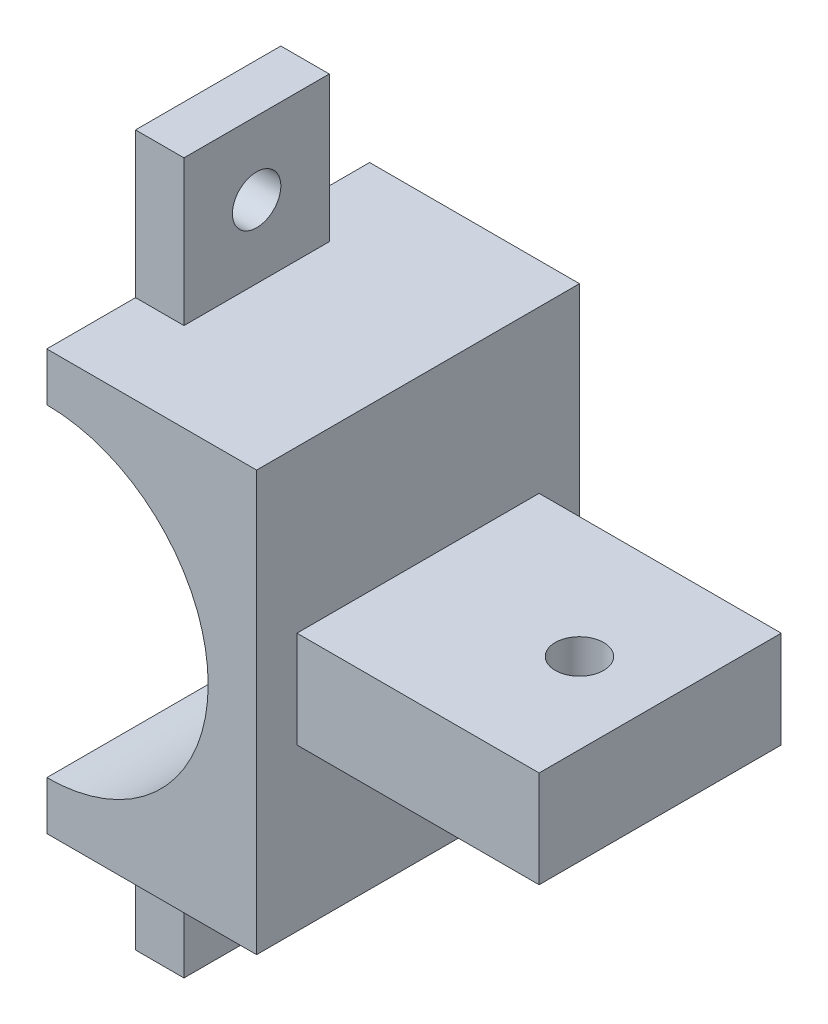
ISO-10303-21;
HEADER;
FILE_DESCRIPTION(('STEP AP214'),'2;1');
FILE_NAME('part.step','',(''),(''),'','','');
FILE_SCHEMA(('AUTOMOTIVE_DESIGN { 1 0 10303 214 1 1 1 1 }'));
ENDSEC;
DATA;
#1=APPLICATION_CONTEXT('core data for automotive mechanical design processes');
#2=APPLICATION_PROTOCOL_DEFINITION('international standard','automotive_design',2000,#1);
#3=PRODUCT_CONTEXT('',#1,'mechanical');
#4=PRODUCT('Part','Part','',(#3));
#5=PRODUCT_RELATED_PRODUCT_CATEGORY('part','',(#4));
#6=PRODUCT_DEFINITION_FORMATION('','',#4);
#7=PRODUCT_DEFINITION_CONTEXT('part definition',#1,'design');
#8=PRODUCT_DEFINITION('design','',#6,#7);
#9=PRODUCT_DEFINITION_SHAPE('','',#8);
#10=(LENGTH_UNIT() NAMED_UNIT(*) SI_UNIT(.MILLI.,.METRE.));
#11=(NAMED_UNIT(*) PLANE_ANGLE_UNIT() SI_UNIT($,.RADIAN.));
#12=(NAMED_UNIT(*) SI_UNIT($,.STERADIAN.) SOLID_ANGLE_UNIT());
#13=UNCERTAINTY_MEASURE_WITH_UNIT(LENGTH_MEASURE(1.E-05),#10,'distance_accuracy_value','');
#14=(GEOMETRIC_REPRESENTATION_CONTEXT(3) GLOBAL_UNCERTAINTY_ASSIGNED_CONTEXT((#13)) GLOBAL_UNIT_ASSIGNED_CONTEXT((#10,
#11,#12)) REPRESENTATION_CONTEXT('',''));
#15=CARTESIAN_POINT('',(0.,0.,0.));
#16=DIRECTION('',(0.,0.,1.));
#17=DIRECTION('',(1.,0.,0.));
#18=AXIS2_PLACEMENT_3D('',#15,#16,#17);
#19=CARTESIAN_POINT('',(13.,13.,20.));
#20=DIRECTION('',(-1.,0.,0.));
#21=DIRECTION('',(0.,0.,1.));
#22=AXIS2_PLACEMENT_3D('',#19,#20,#21);
#23=PLANE('',#22);
#24=DIRECTION('',(0.,1.,0.));
#25=VECTOR('',#24,1.);
#26=CARTESIAN_POINT('',(13.,13.,0.));
#27=LINE('',#26,#25);
#28=CARTESIAN_POINT('',(13.,-13.,0.));
#29=VERTEX_POINT('',#28);
#30=CARTESIAN_POINT('',(13.,13.,0.));
#31=VERTEX_POINT('',#30);
#32=EDGE_CURVE('E328',#29,#31,#27,.T.);
#33=ORIENTED_EDGE('',*,*,#32,.T.);
#34=DIRECTION('',(0.,0.,-1.));
#35=VECTOR('',#34,1.);
#36=CARTESIAN_POINT('',(13.,13.,20.));
#37=LINE('',#36,#35);
#38=CARTESIAN_POINT('',(13.,13.,20.));
#39=VERTEX_POINT('',#38);
#40=EDGE_CURVE('E345',#39,#31,#37,.T.);
#41=ORIENTED_EDGE('',*,*,#40,.F.);
#42=DIRECTION('',(0.,1.,0.));
#43=VECTOR('',#42,1.);
#44=CARTESIAN_POINT('',(13.,13.,20.));
#45=LINE('',#44,#43);
#46=CARTESIAN_POINT('',(13.,-13.,20.));
#47=VERTEX_POINT('',#46);
#48=EDGE_CURVE('E308',#47,#39,#45,.T.);
#49=ORIENTED_EDGE('',*,*,#48,.F.);
#50=DIRECTION('',(0.,0.,-1.));
#51=VECTOR('',#50,1.);
#52=CARTESIAN_POINT('',(13.,-13.,20.));
#53=LINE('',#52,#51);
#54=EDGE_CURVE('E349',#47,#29,#53,.T.);
#55=ORIENTED_EDGE('',*,*,#54,.T.);
#56=EDGE_LOOP('',(#33,#41,#49,#55));
#57=FACE_BOUND('',#56,.T.);
#58=DIRECTION('',(0.,0.,1.));
#59=VECTOR('',#58,1.);
#60=CARTESIAN_POINT('',(13.,3.,17.5));
#61=LINE('',#60,#59);
#62=CARTESIAN_POINT('',(13.,3.,2.5));
#63=VERTEX_POINT('',#62);
#64=CARTESIAN_POINT('',(13.,3.,17.5));
#65=VERTEX_POINT('',#64);
#66=EDGE_CURVE('E56',#63,#65,#61,.T.);
#67=ORIENTED_EDGE('',*,*,#66,.F.);
#68=DIRECTION('',(0.,1.,0.));
#69=VECTOR('',#68,1.);
#70=CARTESIAN_POINT('',(13.,-3.,2.5));
#71=LINE('',#70,#69);
#72=CARTESIAN_POINT('',(13.,-3.,2.5));
#73=VERTEX_POINT('',#72);
#74=EDGE_CURVE('E60',#73,#63,#71,.T.);
#75=ORIENTED_EDGE('',*,*,#74,.F.);
#76=DIRECTION('',(0.,0.,-1.));
#77=VECTOR('',#76,1.);
#78=CARTESIAN_POINT('',(13.,-3.,17.5));
#79=LINE('',#78,#77);
#80=CARTESIAN_POINT('',(13.,-3.,17.5));
#81=VERTEX_POINT('',#80);
#82=EDGE_CURVE('E203',#81,#73,#79,.T.);
#83=ORIENTED_EDGE('',*,*,#82,.F.);
#84=DIRECTION('',(0.,-1.,0.));
#85=VECTOR('',#84,1.);
#86=CARTESIAN_POINT('',(13.,3.,17.5));
#87=LINE('',#86,#85);
#88=EDGE_CURVE('E200',#65,#81,#87,.T.);
#89=ORIENTED_EDGE('',*,*,#88,.F.);
#90=EDGE_LOOP('',(#67,#75,#83,#89));
#91=FACE_BOUND('',#90,.T.);
#92=ADVANCED_FACE('F39',(#57,#91),#23,.F.);
#93=CARTESIAN_POINT('',(0.,0.,20.));
#94=DIRECTION('',(0.,0.,-1.));
#95=DIRECTION('',(-1.,0.,0.));
#96=AXIS2_PLACEMENT_3D('',#93,#94,#95);
#97=CYLINDRICAL_SURFACE('',#96,10.);
#98=CARTESIAN_POINT('',(0.,0.,0.));
#99=DIRECTION('',(0.,0.,-1.));
#100=DIRECTION('',(-1.,0.,0.));
#101=AXIS2_PLACEMENT_3D('',#98,#99,#100);
#102=CIRCLE('',#101,10.);
#103=CARTESIAN_POINT('',(0.,10.,0.));
#104=VERTEX_POINT('',#103);
#105=CARTESIAN_POINT('',(0.,-10.,0.));
#106=VERTEX_POINT('',#105);
#107=EDGE_CURVE('E296',#104,#106,#102,.T.);
#108=ORIENTED_EDGE('',*,*,#107,.T.);
#109=DIRECTION('',(0.,0.,-1.));
#110=VECTOR('',#109,1.);
#111=CARTESIAN_POINT('',(0.,-10.,20.));
#112=LINE('',#111,#110);
#113=CARTESIAN_POINT('',(0.,-10.,20.));
#114=VERTEX_POINT('',#113);
#115=EDGE_CURVE('E357',#114,#106,#112,.T.);
#116=ORIENTED_EDGE('',*,*,#115,.F.);
#117=CARTESIAN_POINT('',(0.,0.,20.));
#118=DIRECTION('',(0.,0.,-1.));
#119=DIRECTION('',(-1.,0.,0.));
#120=AXIS2_PLACEMENT_3D('',#117,#118,#119);
#121=CIRCLE('',#120,10.);
#122=CARTESIAN_POINT('',(0.,10.,20.));
#123=VERTEX_POINT('',#122);
#124=EDGE_CURVE('E297',#123,#114,#121,.T.);
#125=ORIENTED_EDGE('',*,*,#124,.F.);
#126=DIRECTION('',(0.,0.,-1.));
#127=VECTOR('',#126,1.);
#128=CARTESIAN_POINT('',(0.,10.,20.));
#129=LINE('',#128,#127);
#130=EDGE_CURVE('E317',#123,#104,#129,.T.);
#131=ORIENTED_EDGE('',*,*,#130,.T.);
#132=EDGE_LOOP('',(#108,#116,#125,#131));
#133=FACE_BOUND('',#132,.T.);
#134=ADVANCED_FACE('F41',(#133),#97,.F.);
#135=CARTESIAN_POINT('',(0.,-10.,20.));
#136=DIRECTION('',(1.,0.,0.));
#137=DIRECTION('',(0.,0.,-1.));
#138=AXIS2_PLACEMENT_3D('',#135,#136,#137);
#139=PLANE('',#138);
#140=ORIENTED_EDGE('',*,*,#115,.T.);
#141=DIRECTION('',(0.,-1.,0.));
#142=VECTOR('',#141,1.);
#143=CARTESIAN_POINT('',(0.,-10.,0.));
#144=LINE('',#143,#142);
#145=CARTESIAN_POINT('',(0.,-13.,0.));
#146=VERTEX_POINT('',#145);
#147=EDGE_CURVE('E321',#106,#146,#144,.T.);
#148=ORIENTED_EDGE('',*,*,#147,.T.);
#149=DIRECTION('',(0.,0.,-1.));
#150=VECTOR('',#149,1.);
#151=CARTESIAN_POINT('',(0.,-13.,20.));
#152=LINE('',#151,#150);
#153=CARTESIAN_POINT('',(0.,-13.,5.5));
#154=VERTEX_POINT('',#153);
#155=EDGE_CURVE('E353',#154,#146,#152,.T.);
#156=ORIENTED_EDGE('',*,*,#155,.F.);
#157=DIRECTION('',(0.,-1.,0.));
#158=VECTOR('',#157,1.);
#159=CARTESIAN_POINT('',(0.,-10.,5.5));
#160=LINE('',#159,#158);
#161=CARTESIAN_POINT('',(0.,-22.,5.5));
#162=VERTEX_POINT('',#161);
#163=EDGE_CURVE('E229',#154,#162,#160,.T.);
#164=ORIENTED_EDGE('',*,*,#163,.T.);
#165=DIRECTION('',(0.,0.,1.));
#166=VECTOR('',#165,1.);
#167=CARTESIAN_POINT('',(0.,-22.,5.5));
#168=LINE('',#167,#166);
#169=CARTESIAN_POINT('',(0.,-22.,14.5));
#170=VERTEX_POINT('',#169);
#171=EDGE_CURVE('E220',#162,#170,#168,.T.);
#172=ORIENTED_EDGE('',*,*,#171,.T.);
#173=DIRECTION('',(0.,1.,0.));
#174=VECTOR('',#173,1.);
#175=CARTESIAN_POINT('',(0.,-22.,14.5));
#176=LINE('',#175,#174);
#177=CARTESIAN_POINT('',(0.,-13.,14.5));
#178=VERTEX_POINT('',#177);
#179=EDGE_CURVE('E240',#170,#178,#176,.T.);
#180=ORIENTED_EDGE('',*,*,#179,.T.);
#181=CARTESIAN_POINT('',(0.,-13.,20.));
#182=VERTEX_POINT('',#181);
#183=EDGE_CURVE('E354',#182,#178,#152,.T.);
#184=ORIENTED_EDGE('',*,*,#183,.F.);
#185=DIRECTION('',(0.,-1.,0.));
#186=VECTOR('',#185,1.);
#187=CARTESIAN_POINT('',(0.,-10.,20.));
#188=LINE('',#187,#186);
#189=EDGE_CURVE('E301',#114,#182,#188,.T.);
#190=ORIENTED_EDGE('',*,*,#189,.F.);
#191=EDGE_LOOP('',(#140,#148,#156,#164,#172,#180,#184,#190));
#192=FACE_BOUND('',#191,.T.);
#193=CARTESIAN_POINT('',(0.,-17.5,10.));
#194=DIRECTION('',(-1.,0.,0.));
#195=DIRECTION('',(0.,0.,1.));
#196=AXIS2_PLACEMENT_3D('',#193,#194,#195);
#197=CIRCLE('',#196,1.5);
#198=CARTESIAN_POINT('',(0.,-17.5,11.5));
#199=VERTEX_POINT('',#198);
#200=EDGE_CURVE('E182',#199,#199,#197,.T.);
#201=ORIENTED_EDGE('',*,*,#200,.F.);
#202=EDGE_LOOP('',(#201));
#203=FACE_BOUND('',#202,.T.);
#204=ADVANCED_FACE('F395',(#192,#203),#139,.F.);
#205=CARTESIAN_POINT('',(13.,-13.,20.));
#206=DIRECTION('',(0.,1.,0.));
#207=DIRECTION('',(0.,0.,1.));
#208=AXIS2_PLACEMENT_3D('',#205,#206,#207);
#209=PLANE('',#208);
#210=DIRECTION('',(0.,0.,1.));
#211=VECTOR('',#210,1.);
#212=CARTESIAN_POINT('',(3.,-13.,20.));
#213=LINE('',#212,#211);
#214=CARTESIAN_POINT('',(3.,-13.,5.5));
#215=VERTEX_POINT('',#214);
#216=CARTESIAN_POINT('',(3.,-13.,14.5));
#217=VERTEX_POINT('',#216);
#218=EDGE_CURVE('E364',#215,#217,#213,.T.);
#219=ORIENTED_EDGE('',*,*,#218,.F.);
#220=DIRECTION('',(-1.,0.,0.));
#221=VECTOR('',#220,1.);
#222=CARTESIAN_POINT('',(13.,-13.,5.5));
#223=LINE('',#222,#221);
#224=EDGE_CURVE('E11',#215,#154,#223,.T.);
#225=ORIENTED_EDGE('',*,*,#224,.T.);
#226=ORIENTED_EDGE('',*,*,#155,.T.);
#227=DIRECTION('',(1.,0.,0.));
#228=VECTOR('',#227,1.);
#229=CARTESIAN_POINT('',(13.,-13.,0.));
#230=LINE('',#229,#228);
#231=EDGE_CURVE('E325',#146,#29,#230,.T.);
#232=ORIENTED_EDGE('',*,*,#231,.T.);
#233=ORIENTED_EDGE('',*,*,#54,.F.);
#234=DIRECTION('',(1.,0.,0.));
#235=VECTOR('',#234,1.);
#236=CARTESIAN_POINT('',(13.,-13.,20.));
#237=LINE('',#236,#235);
#238=EDGE_CURVE('E305',#182,#47,#237,.T.);
#239=ORIENTED_EDGE('',*,*,#238,.F.);
#240=ORIENTED_EDGE('',*,*,#183,.T.);
#241=DIRECTION('',(1.,0.,0.));
#242=VECTOR('',#241,1.);
#243=CARTESIAN_POINT('',(13.,-13.,14.5));
#244=LINE('',#243,#242);
#245=EDGE_CURVE('E49',#178,#217,#244,.T.);
#246=ORIENTED_EDGE('',*,*,#245,.T.);
#247=EDGE_LOOP('',(#219,#225,#226,#232,#233,#239,#240,#246));
#248=FACE_BOUND('',#247,.T.);
#249=ADVANCED_FACE('F371',(#248),#209,.F.);
#250=CARTESIAN_POINT('',(0.,13.,20.));
#251=DIRECTION('',(0.,-1.,0.));
#252=DIRECTION('',(0.,0.,-1.));
#253=AXIS2_PLACEMENT_3D('',#250,#251,#252);
#254=PLANE('',#253);
#255=DIRECTION('',(0.,0.,-1.));
#256=VECTOR('',#255,1.);
#257=CARTESIAN_POINT('',(0.,13.,20.));
#258=LINE('',#257,#256);
#259=CARTESIAN_POINT('',(0.,13.,5.5));
#260=VERTEX_POINT('',#259);
#261=CARTESIAN_POINT('',(0.,13.,0.));
#262=VERTEX_POINT('',#261);
#263=EDGE_CURVE('E340',#260,#262,#258,.T.);
#264=ORIENTED_EDGE('',*,*,#263,.F.);
#265=DIRECTION('',(1.,0.,0.));
#266=VECTOR('',#265,1.);
#267=CARTESIAN_POINT('',(0.,13.,5.5));
#268=LINE('',#267,#266);
#269=CARTESIAN_POINT('',(3.,13.,5.5));
#270=VERTEX_POINT('',#269);
#271=EDGE_CURVE('E292',#260,#270,#268,.T.);
#272=ORIENTED_EDGE('',*,*,#271,.T.);
#273=DIRECTION('',(0.,0.,1.));
#274=VECTOR('',#273,1.);
#275=CARTESIAN_POINT('',(3.,13.,20.));
#276=LINE('',#275,#274);
#277=CARTESIAN_POINT('',(3.,13.,14.5));
#278=VERTEX_POINT('',#277);
#279=EDGE_CURVE('E360',#270,#278,#276,.T.);
#280=ORIENTED_EDGE('',*,*,#279,.T.);
#281=DIRECTION('',(-1.,0.,0.));
#282=VECTOR('',#281,1.);
#283=CARTESIAN_POINT('',(0.,13.,14.5));
#284=LINE('',#283,#282);
#285=CARTESIAN_POINT('',(0.,13.,14.5));
#286=VERTEX_POINT('',#285);
#287=EDGE_CURVE('E285',#278,#286,#284,.T.);
#288=ORIENTED_EDGE('',*,*,#287,.T.);
#289=CARTESIAN_POINT('',(0.,13.,20.));
#290=VERTEX_POINT('',#289);
#291=EDGE_CURVE('E341',#290,#286,#258,.T.);
#292=ORIENTED_EDGE('',*,*,#291,.F.);
#293=DIRECTION('',(-1.,0.,0.));
#294=VECTOR('',#293,1.);
#295=CARTESIAN_POINT('',(0.,13.,20.));
#296=LINE('',#295,#294);
#297=EDGE_CURVE('E311',#39,#290,#296,.T.);
#298=ORIENTED_EDGE('',*,*,#297,.F.);
#299=ORIENTED_EDGE('',*,*,#40,.T.);
#300=DIRECTION('',(-1.,0.,0.));
#301=VECTOR('',#300,1.);
#302=CARTESIAN_POINT('',(0.,13.,0.));
#303=LINE('',#302,#301);
#304=EDGE_CURVE('E331',#31,#262,#303,.T.);
#305=ORIENTED_EDGE('',*,*,#304,.T.);
#306=EDGE_LOOP('',(#264,#272,#280,#288,#292,#298,#299,#305));
#307=FACE_BOUND('',#306,.T.);
#308=ADVANCED_FACE('F410',(#307),#254,.F.);
#309=CARTESIAN_POINT('',(0.,10.,20.));
#310=DIRECTION('',(1.,0.,0.));
#311=DIRECTION('',(0.,0.,-1.));
#312=AXIS2_PLACEMENT_3D('',#309,#310,#311);
#313=PLANE('',#312);
#314=ORIENTED_EDGE('',*,*,#291,.T.);
#315=DIRECTION('',(0.,1.,0.));
#316=VECTOR('',#315,1.);
#317=CARTESIAN_POINT('',(0.,22.,14.5));
#318=LINE('',#317,#316);
#319=CARTESIAN_POINT('',(0.,22.,14.5));
#320=VERTEX_POINT('',#319);
#321=EDGE_CURVE('E257',#286,#320,#318,.T.);
#322=ORIENTED_EDGE('',*,*,#321,.T.);
#323=DIRECTION('',(0.,0.,-1.));
#324=VECTOR('',#323,1.);
#325=CARTESIAN_POINT('',(0.,22.,5.5));
#326=LINE('',#325,#324);
#327=CARTESIAN_POINT('',(0.,22.,5.5));
#328=VERTEX_POINT('',#327);
#329=EDGE_CURVE('E276',#320,#328,#326,.T.);
#330=ORIENTED_EDGE('',*,*,#329,.T.);
#331=DIRECTION('',(0.,-1.,0.));
#332=VECTOR('',#331,1.);
#333=CARTESIAN_POINT('',(0.,10.,5.5));
#334=LINE('',#333,#332);
#335=EDGE_CURVE('E265',#328,#260,#334,.T.);
#336=ORIENTED_EDGE('',*,*,#335,.T.);
#337=ORIENTED_EDGE('',*,*,#263,.T.);
#338=DIRECTION('',(0.,-1.,0.));
#339=VECTOR('',#338,1.);
#340=CARTESIAN_POINT('',(0.,10.,0.));
#341=LINE('',#340,#339);
#342=EDGE_CURVE('E302',#262,#104,#341,.T.);
#343=ORIENTED_EDGE('',*,*,#342,.T.);
#344=ORIENTED_EDGE('',*,*,#130,.F.);
#345=DIRECTION('',(0.,-1.,0.));
#346=VECTOR('',#345,1.);
#347=CARTESIAN_POINT('',(0.,10.,20.));
#348=LINE('',#347,#346);
#349=EDGE_CURVE('E314',#290,#123,#348,.T.);
#350=ORIENTED_EDGE('',*,*,#349,.F.);
#351=EDGE_LOOP('',(#314,#322,#330,#336,#337,#343,#344,#350));
#352=FACE_BOUND('',#351,.T.);
#353=CARTESIAN_POINT('',(0.,17.5,10.));
#354=DIRECTION('',(-1.,0.,0.));
#355=DIRECTION('',(0.,0.,1.));
#356=AXIS2_PLACEMENT_3D('',#353,#354,#355);
#357=CIRCLE('',#356,1.5);
#358=CARTESIAN_POINT('',(0.,17.5,11.5));
#359=VERTEX_POINT('',#358);
#360=EDGE_CURVE('E250',#359,#359,#357,.T.);
#361=ORIENTED_EDGE('',*,*,#360,.F.);
#362=EDGE_LOOP('',(#361));
#363=FACE_BOUND('',#362,.T.);
#364=ADVANCED_FACE('F419',(#352,#363),#313,.F.);
#365=CARTESIAN_POINT('',(0.,0.,20.));
#366=DIRECTION('',(0.,0.,-1.));
#367=DIRECTION('',(-1.,0.,0.));
#368=AXIS2_PLACEMENT_3D('',#365,#366,#367);
#369=PLANE('',#368);
#370=ORIENTED_EDGE('',*,*,#124,.T.);
#371=ORIENTED_EDGE('',*,*,#189,.T.);
#372=ORIENTED_EDGE('',*,*,#238,.T.);
#373=ORIENTED_EDGE('',*,*,#48,.T.);
#374=ORIENTED_EDGE('',*,*,#297,.T.);
#375=ORIENTED_EDGE('',*,*,#349,.T.);
#376=EDGE_LOOP('',(#370,#371,#372,#373,#374,#375));
#377=FACE_BOUND('',#376,.T.);
#378=ADVANCED_FACE('F414',(#377),#369,.F.);
#379=CARTESIAN_POINT('',(0.,0.,0.));
#380=DIRECTION('',(0.,0.,-1.));
#381=DIRECTION('',(-1.,0.,0.));
#382=AXIS2_PLACEMENT_3D('',#379,#380,#381);
#383=PLANE('',#382);
#384=ORIENTED_EDGE('',*,*,#107,.F.);
#385=ORIENTED_EDGE('',*,*,#342,.F.);
#386=ORIENTED_EDGE('',*,*,#304,.F.);
#387=ORIENTED_EDGE('',*,*,#32,.F.);
#388=ORIENTED_EDGE('',*,*,#231,.F.);
#389=ORIENTED_EDGE('',*,*,#147,.F.);
#390=EDGE_LOOP('',(#384,#385,#386,#387,#388,#389));
#391=FACE_BOUND('',#390,.T.);
#392=ADVANCED_FACE('F401',(#391),#383,.T.);
#393=CARTESIAN_POINT('',(3.,0.,0.));
#394=DIRECTION('',(1.,0.,0.));
#395=DIRECTION('',(0.,0.,-1.));
#396=AXIS2_PLACEMENT_3D('',#393,#394,#395);
#397=PLANE('',#396);
#398=CARTESIAN_POINT('',(3.,17.5,10.));
#399=DIRECTION('',(-1.,0.,0.));
#400=DIRECTION('',(0.,0.,1.));
#401=AXIS2_PLACEMENT_3D('',#398,#399,#400);
#402=CIRCLE('',#401,1.5);
#403=CARTESIAN_POINT('',(3.,17.5,11.5));
#404=VERTEX_POINT('',#403);
#405=EDGE_CURVE('E253',#404,#404,#402,.T.);
#406=ORIENTED_EDGE('',*,*,#405,.T.);
#407=EDGE_LOOP('',(#406));
#408=FACE_BOUND('',#407,.T.);
#409=ORIENTED_EDGE('',*,*,#279,.F.);
#410=DIRECTION('',(0.,-1.,0.));
#411=VECTOR('',#410,1.);
#412=CARTESIAN_POINT('',(3.,10.,5.5));
#413=LINE('',#412,#411);
#414=CARTESIAN_POINT('',(3.,22.,5.5));
#415=VERTEX_POINT('',#414);
#416=EDGE_CURVE('E269',#415,#270,#413,.T.);
#417=ORIENTED_EDGE('',*,*,#416,.F.);
#418=DIRECTION('',(0.,0.,-1.));
#419=VECTOR('',#418,1.);
#420=CARTESIAN_POINT('',(3.,22.,5.5));
#421=LINE('',#420,#419);
#422=CARTESIAN_POINT('',(3.,22.,14.5));
#423=VERTEX_POINT('',#422);
#424=EDGE_CURVE('E264',#423,#415,#421,.T.);
#425=ORIENTED_EDGE('',*,*,#424,.F.);
#426=DIRECTION('',(0.,1.,0.));
#427=VECTOR('',#426,1.);
#428=CARTESIAN_POINT('',(3.,22.,14.5));
#429=LINE('',#428,#427);
#430=EDGE_CURVE('E261',#278,#423,#429,.T.);
#431=ORIENTED_EDGE('',*,*,#430,.F.);
#432=EDGE_LOOP('',(#409,#417,#425,#431));
#433=FACE_BOUND('',#432,.T.);
#434=ADVANCED_FACE('F429',(#408,#433),#397,.T.);
#435=CARTESIAN_POINT('',(3.,10.,5.5));
#436=DIRECTION('',(0.,0.,-1.));
#437=DIRECTION('',(-1.,0.,0.));
#438=AXIS2_PLACEMENT_3D('',#435,#436,#437);
#439=PLANE('',#438);
#440=ORIENTED_EDGE('',*,*,#271,.F.);
#441=ORIENTED_EDGE('',*,*,#335,.F.);
#442=DIRECTION('',(-1.,0.,0.));
#443=VECTOR('',#442,1.);
#444=CARTESIAN_POINT('',(3.,22.,5.5));
#445=LINE('',#444,#443);
#446=EDGE_CURVE('E282',#415,#328,#445,.T.);
#447=ORIENTED_EDGE('',*,*,#446,.F.);
#448=ORIENTED_EDGE('',*,*,#416,.T.);
#449=EDGE_LOOP('',(#440,#441,#447,#448));
#450=FACE_BOUND('',#449,.T.);
#451=ADVANCED_FACE('F425',(#450),#439,.T.);
#452=CARTESIAN_POINT('',(3.,22.,14.5));
#453=DIRECTION('',(0.,0.,1.));
#454=DIRECTION('',(1.,0.,0.));
#455=AXIS2_PLACEMENT_3D('',#452,#453,#454);
#456=PLANE('',#455);
#457=ORIENTED_EDGE('',*,*,#287,.F.);
#458=ORIENTED_EDGE('',*,*,#430,.T.);
#459=DIRECTION('',(-1.,0.,0.));
#460=VECTOR('',#459,1.);
#461=CARTESIAN_POINT('',(3.,22.,14.5));
#462=LINE('',#461,#460);
#463=EDGE_CURVE('E273',#423,#320,#462,.T.);
#464=ORIENTED_EDGE('',*,*,#463,.T.);
#465=ORIENTED_EDGE('',*,*,#321,.F.);
#466=EDGE_LOOP('',(#457,#458,#464,#465));
#467=FACE_BOUND('',#466,.T.);
#468=ADVANCED_FACE('F433',(#467),#456,.T.);
#469=CARTESIAN_POINT('',(3.,22.,5.5));
#470=DIRECTION('',(0.,1.,0.));
#471=DIRECTION('',(0.,0.,1.));
#472=AXIS2_PLACEMENT_3D('',#469,#470,#471);
#473=PLANE('',#472);
#474=ORIENTED_EDGE('',*,*,#329,.F.);
#475=ORIENTED_EDGE('',*,*,#463,.F.);
#476=ORIENTED_EDGE('',*,*,#424,.T.);
#477=ORIENTED_EDGE('',*,*,#446,.T.);
#478=EDGE_LOOP('',(#474,#475,#476,#477));
#479=FACE_BOUND('',#478,.T.);
#480=ADVANCED_FACE('F436',(#479),#473,.T.);
#481=CARTESIAN_POINT('',(3.,17.5,10.));
#482=DIRECTION('',(-1.,0.,0.));
#483=DIRECTION('',(0.,0.,1.));
#484=AXIS2_PLACEMENT_3D('',#481,#482,#483);
#485=CYLINDRICAL_SURFACE('',#484,1.5);
#486=ORIENTED_EDGE('',*,*,#405,.F.);
#487=EDGE_LOOP('',(#486));
#488=FACE_BOUND('',#487,.T.);
#489=ORIENTED_EDGE('',*,*,#360,.T.);
#490=EDGE_LOOP('',(#489));
#491=FACE_BOUND('',#490,.T.);
#492=ADVANCED_FACE('F438',(#488,#491),#485,.F.);
#493=CARTESIAN_POINT('',(3.,-10.,5.5));
#494=DIRECTION('',(0.,0.,-1.));
#495=DIRECTION('',(-1.,0.,0.));
#496=AXIS2_PLACEMENT_3D('',#493,#494,#495);
#497=PLANE('',#496);
#498=ORIENTED_EDGE('',*,*,#224,.F.);
#499=DIRECTION('',(0.,-1.,0.));
#500=VECTOR('',#499,1.);
#501=CARTESIAN_POINT('',(3.,-10.,5.5));
#502=LINE('',#501,#500);
#503=CARTESIAN_POINT('',(3.,-22.,5.5));
#504=VERTEX_POINT('',#503);
#505=EDGE_CURVE('E233',#215,#504,#502,.T.);
#506=ORIENTED_EDGE('',*,*,#505,.T.);
#507=DIRECTION('',(-1.,0.,0.));
#508=VECTOR('',#507,1.);
#509=CARTESIAN_POINT('',(3.,-22.,5.5));
#510=LINE('',#509,#508);
#511=EDGE_CURVE('E246',#504,#162,#510,.T.);
#512=ORIENTED_EDGE('',*,*,#511,.T.);
#513=ORIENTED_EDGE('',*,*,#163,.F.);
#514=EDGE_LOOP('',(#498,#506,#512,#513));
#515=FACE_BOUND('',#514,.T.);
#516=ADVANCED_FACE('F389',(#515),#497,.T.);
#517=CARTESIAN_POINT('',(3.,-22.,14.5));
#518=DIRECTION('',(0.,0.,1.));
#519=DIRECTION('',(1.,0.,0.));
#520=AXIS2_PLACEMENT_3D('',#517,#518,#519);
#521=PLANE('',#520);
#522=ORIENTED_EDGE('',*,*,#245,.F.);
#523=ORIENTED_EDGE('',*,*,#179,.F.);
#524=DIRECTION('',(-1.,0.,0.));
#525=VECTOR('',#524,1.);
#526=CARTESIAN_POINT('',(3.,-22.,14.5));
#527=LINE('',#526,#525);
#528=CARTESIAN_POINT('',(3.,-22.,14.5));
#529=VERTEX_POINT('',#528);
#530=EDGE_CURVE('E236',#529,#170,#527,.T.);
#531=ORIENTED_EDGE('',*,*,#530,.F.);
#532=DIRECTION('',(0.,1.,0.));
#533=VECTOR('',#532,1.);
#534=CARTESIAN_POINT('',(3.,-22.,14.5));
#535=LINE('',#534,#533);
#536=EDGE_CURVE('E228',#529,#217,#535,.T.);
#537=ORIENTED_EDGE('',*,*,#536,.T.);
#538=EDGE_LOOP('',(#522,#523,#531,#537));
#539=FACE_BOUND('',#538,.T.);
#540=ADVANCED_FACE('F382',(#539),#521,.T.);
#541=CARTESIAN_POINT('',(3.,0.,0.));
#542=DIRECTION('',(-1.,0.,0.));
#543=DIRECTION('',(0.,0.,1.));
#544=AXIS2_PLACEMENT_3D('',#541,#542,#543);
#545=PLANE('',#544);
#546=CARTESIAN_POINT('',(3.,-17.5,10.));
#547=DIRECTION('',(-1.,0.,0.));
#548=DIRECTION('',(0.,0.,1.));
#549=AXIS2_PLACEMENT_3D('',#546,#547,#548);
#550=CIRCLE('',#549,1.5);
#551=CARTESIAN_POINT('',(3.,-17.5,11.5));
#552=VERTEX_POINT('',#551);
#553=EDGE_CURVE('E216',#552,#552,#550,.T.);
#554=ORIENTED_EDGE('',*,*,#553,.T.);
#555=EDGE_LOOP('',(#554));
#556=FACE_BOUND('',#555,.T.);
#557=ORIENTED_EDGE('',*,*,#505,.F.);
#558=ORIENTED_EDGE('',*,*,#218,.T.);
#559=ORIENTED_EDGE('',*,*,#536,.F.);
#560=DIRECTION('',(0.,0.,1.));
#561=VECTOR('',#560,1.);
#562=CARTESIAN_POINT('',(3.,-22.,5.5));
#563=LINE('',#562,#561);
#564=EDGE_CURVE('E224',#504,#529,#563,.T.);
#565=ORIENTED_EDGE('',*,*,#564,.F.);
#566=EDGE_LOOP('',(#557,#558,#559,#565));
#567=FACE_BOUND('',#566,.T.);
#568=ADVANCED_FACE('F380',(#556,#567),#545,.F.);
#569=CARTESIAN_POINT('',(3.,-22.,5.5));
#570=DIRECTION('',(0.,-1.,0.));
#571=DIRECTION('',(0.,0.,-1.));
#572=AXIS2_PLACEMENT_3D('',#569,#570,#571);
#573=PLANE('',#572);
#574=ORIENTED_EDGE('',*,*,#171,.F.);
#575=ORIENTED_EDGE('',*,*,#511,.F.);
#576=ORIENTED_EDGE('',*,*,#564,.T.);
#577=ORIENTED_EDGE('',*,*,#530,.T.);
#578=EDGE_LOOP('',(#574,#575,#576,#577));
#579=FACE_BOUND('',#578,.T.);
#580=ADVANCED_FACE('F385',(#579),#573,.T.);
#581=CARTESIAN_POINT('',(3.,-17.5,10.));
#582=DIRECTION('',(-1.,0.,0.));
#583=DIRECTION('',(0.,0.,1.));
#584=AXIS2_PLACEMENT_3D('',#581,#582,#583);
#585=CYLINDRICAL_SURFACE('',#584,1.5);
#586=ORIENTED_EDGE('',*,*,#553,.F.);
#587=EDGE_LOOP('',(#586));
#588=FACE_BOUND('',#587,.T.);
#589=ORIENTED_EDGE('',*,*,#200,.T.);
#590=EDGE_LOOP('',(#589));
#591=FACE_BOUND('',#590,.T.);
#592=ADVANCED_FACE('F548',(#588,#591),#585,.F.);
#593=CARTESIAN_POINT('',(28.,3.,17.5));
#594=DIRECTION('',(0.,-1.,0.));
#595=DIRECTION('',(0.,0.,-1.));
#596=AXIS2_PLACEMENT_3D('',#593,#594,#595);
#597=PLANE('',#596);
#598=CARTESIAN_POINT('',(23.,3.,10.));
#599=DIRECTION('',(0.,1.,0.));
#600=DIRECTION('',(0.,0.,1.));
#601=AXIS2_PLACEMENT_3D('',#598,#599,#600);
#602=CIRCLE('',#601,1.5);
#603=CARTESIAN_POINT('',(23.,3.,11.5));
#604=VERTEX_POINT('',#603);
#605=EDGE_CURVE('E624',#604,#604,#602,.T.);
#606=ORIENTED_EDGE('',*,*,#605,.F.);
#607=EDGE_LOOP('',(#606));
#608=FACE_BOUND('',#607,.T.);
#609=ORIENTED_EDGE('',*,*,#66,.T.);
#610=DIRECTION('',(-1.,0.,0.));
#611=VECTOR('',#610,1.);
#612=CARTESIAN_POINT('',(28.,3.,17.5));
#613=LINE('',#612,#611);
#614=CARTESIAN_POINT('',(28.,3.,17.5));
#615=VERTEX_POINT('',#614);
#616=EDGE_CURVE('E177',#615,#65,#613,.T.);
#617=ORIENTED_EDGE('',*,*,#616,.F.);
#618=DIRECTION('',(0.,0.,1.));
#619=VECTOR('',#618,1.);
#620=CARTESIAN_POINT('',(28.,3.,10.));
#621=LINE('',#620,#619);
#622=CARTESIAN_POINT('',(28.,3.,2.5));
#623=VERTEX_POINT('',#622);
#624=EDGE_CURVE('E163',#623,#615,#621,.T.);
#625=ORIENTED_EDGE('',*,*,#624,.F.);
#626=DIRECTION('',(-1.,0.,0.));
#627=VECTOR('',#626,1.);
#628=CARTESIAN_POINT('',(28.,3.,2.5));
#629=LINE('',#628,#627);
#630=EDGE_CURVE('E197',#623,#63,#629,.T.);
#631=ORIENTED_EDGE('',*,*,#630,.T.);
#632=EDGE_LOOP('',(#609,#617,#625,#631));
#633=FACE_BOUND('',#632,.T.);
#634=ADVANCED_FACE('F178',(#608,#633),#597,.F.);
#635=CARTESIAN_POINT('',(28.,3.,17.5));
#636=DIRECTION('',(0.,0.,-1.));
#637=DIRECTION('',(-1.,0.,0.));
#638=AXIS2_PLACEMENT_3D('',#635,#636,#637);
#639=PLANE('',#638);
#640=ORIENTED_EDGE('',*,*,#88,.T.);
#641=DIRECTION('',(-1.,0.,0.));
#642=VECTOR('',#641,1.);
#643=CARTESIAN_POINT('',(28.,-3.,17.5));
#644=LINE('',#643,#642);
#645=CARTESIAN_POINT('',(28.,-3.,17.5));
#646=VERTEX_POINT('',#645);
#647=EDGE_CURVE('E183',#646,#81,#644,.T.);
#648=ORIENTED_EDGE('',*,*,#647,.F.);
#649=DIRECTION('',(0.,-1.,0.));
#650=VECTOR('',#649,1.);
#651=CARTESIAN_POINT('',(28.,3.,17.5));
#652=LINE('',#651,#650);
#653=EDGE_CURVE('E167',#615,#646,#652,.T.);
#654=ORIENTED_EDGE('',*,*,#653,.F.);
#655=ORIENTED_EDGE('',*,*,#616,.T.);
#656=EDGE_LOOP('',(#640,#648,#654,#655));
#657=FACE_BOUND('',#656,.T.);
#658=ADVANCED_FACE('F185',(#657),#639,.F.);
#659=CARTESIAN_POINT('',(28.,-3.,17.5));
#660=DIRECTION('',(0.,1.,0.));
#661=DIRECTION('',(0.,0.,1.));
#662=AXIS2_PLACEMENT_3D('',#659,#660,#661);
#663=PLANE('',#662);
#664=CARTESIAN_POINT('',(23.,-3.,10.));
#665=DIRECTION('',(0.,1.,0.));
#666=DIRECTION('',(0.,0.,1.));
#667=AXIS2_PLACEMENT_3D('',#664,#665,#666);
#668=CIRCLE('',#667,1.5);
#669=CARTESIAN_POINT('',(23.,-3.,11.5));
#670=VERTEX_POINT('',#669);
#671=EDGE_CURVE('E43',#670,#670,#668,.T.);
#672=ORIENTED_EDGE('',*,*,#671,.T.);
#673=EDGE_LOOP('',(#672));
#674=FACE_BOUND('',#673,.T.);
#675=ORIENTED_EDGE('',*,*,#82,.T.);
#676=DIRECTION('',(-1.,0.,0.));
#677=VECTOR('',#676,1.);
#678=CARTESIAN_POINT('',(28.,-3.,2.5));
#679=LINE('',#678,#677);
#680=CARTESIAN_POINT('',(28.,-3.,2.5));
#681=VERTEX_POINT('',#680);
#682=EDGE_CURVE('E210',#681,#73,#679,.T.);
#683=ORIENTED_EDGE('',*,*,#682,.F.);
#684=DIRECTION('',(0.,0.,-1.));
#685=VECTOR('',#684,1.);
#686=CARTESIAN_POINT('',(28.,-3.,17.5));
#687=LINE('',#686,#685);
#688=EDGE_CURVE('E189',#646,#681,#687,.T.);
#689=ORIENTED_EDGE('',*,*,#688,.F.);
#690=ORIENTED_EDGE('',*,*,#647,.T.);
#691=EDGE_LOOP('',(#675,#683,#689,#690));
#692=FACE_BOUND('',#691,.T.);
#693=ADVANCED_FACE('F572',(#674,#692),#663,.F.);
#694=CARTESIAN_POINT('',(28.,-3.,2.5));
#695=DIRECTION('',(0.,0.,1.));
#696=DIRECTION('',(1.,0.,0.));
#697=AXIS2_PLACEMENT_3D('',#694,#695,#696);
#698=PLANE('',#697);
#699=ORIENTED_EDGE('',*,*,#74,.T.);
#700=ORIENTED_EDGE('',*,*,#630,.F.);
#701=DIRECTION('',(0.,1.,0.));
#702=VECTOR('',#701,1.);
#703=CARTESIAN_POINT('',(28.,-3.,2.5));
#704=LINE('',#703,#702);
#705=EDGE_CURVE('E170',#681,#623,#704,.T.);
#706=ORIENTED_EDGE('',*,*,#705,.F.);
#707=ORIENTED_EDGE('',*,*,#682,.T.);
#708=EDGE_LOOP('',(#699,#700,#706,#707));
#709=FACE_BOUND('',#708,.T.);
#710=ADVANCED_FACE('F580',(#709),#698,.F.);
#711=CARTESIAN_POINT('',(28.,0.,0.));
#712=DIRECTION('',(1.,0.,0.));
#713=DIRECTION('',(0.,0.,-1.));
#714=AXIS2_PLACEMENT_3D('',#711,#712,#713);
#715=PLANE('',#714);
#716=ORIENTED_EDGE('',*,*,#624,.T.);
#717=ORIENTED_EDGE('',*,*,#653,.T.);
#718=ORIENTED_EDGE('',*,*,#688,.T.);
#719=ORIENTED_EDGE('',*,*,#705,.T.);
#720=EDGE_LOOP('',(#716,#717,#718,#719));
#721=FACE_BOUND('',#720,.T.);
#722=ADVANCED_FACE('F165',(#721),#715,.T.);
#723=CARTESIAN_POINT('',(23.,-12.,10.));
#724=DIRECTION('',(0.,1.,0.));
#725=DIRECTION('',(0.,0.,1.));
#726=AXIS2_PLACEMENT_3D('',#723,#724,#725);
#727=CYLINDRICAL_SURFACE('',#726,1.5);
#728=ORIENTED_EDGE('',*,*,#605,.T.);
#729=EDGE_LOOP('',(#728));
#730=FACE_BOUND('',#729,.T.);
#731=ORIENTED_EDGE('',*,*,#671,.F.);
#732=EDGE_LOOP('',(#731));
#733=FACE_BOUND('',#732,.T.);
#734=ADVANCED_FACE('F594',(#730,#733),#727,.F.);
#735=CLOSED_SHELL('',(#92,#134,#204,#249,#308,#364,#378,#392,#434,#451,#468,#480,#492,#516,#540,
#568,#580,#592,#634,#658,#693,#710,#722,#734));
#736=MANIFOLD_SOLID_BREP('B2',#735);
#737=ADVANCED_BREP_SHAPE_REPRESENTATION('',(#18,#736),#14);
#738=SHAPE_DEFINITION_REPRESENTATION(#9,#737);
ENDSEC;
END-ISO-10303-21;
